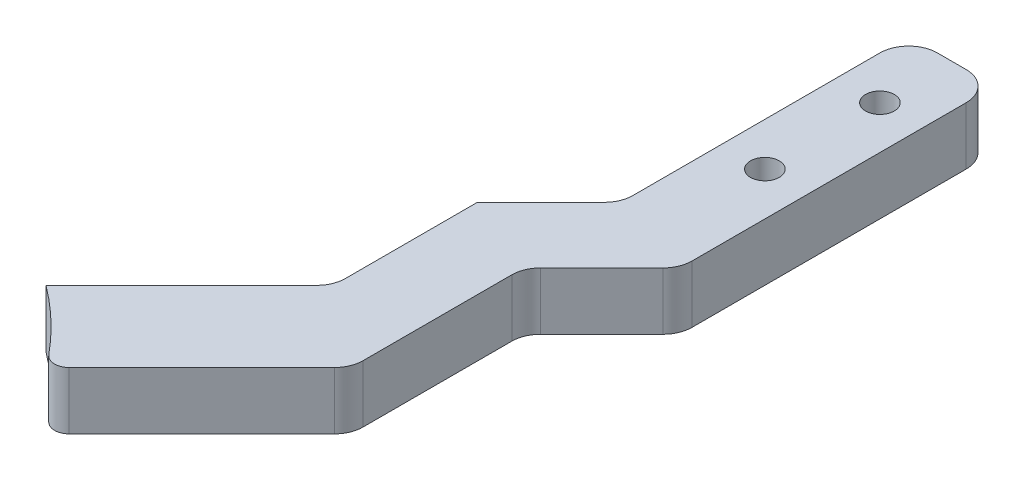
ISO-10303-21;
HEADER;
FILE_DESCRIPTION(('STEP AP214'),'2;1');
FILE_NAME('part.step','',(''),(''),'','','');
FILE_SCHEMA(('AUTOMOTIVE_DESIGN { 1 0 10303 214 1 1 1 1 }'));
ENDSEC;
DATA;
#1=APPLICATION_CONTEXT('core data for automotive mechanical design processes');
#2=APPLICATION_PROTOCOL_DEFINITION('international standard','automotive_design',2000,#1);
#3=PRODUCT_CONTEXT('',#1,'mechanical');
#4=PRODUCT('Part','Part','',(#3));
#5=PRODUCT_RELATED_PRODUCT_CATEGORY('part','',(#4));
#6=PRODUCT_DEFINITION_FORMATION('','',#4);
#7=PRODUCT_DEFINITION_CONTEXT('part definition',#1,'design');
#8=PRODUCT_DEFINITION('design','',#6,#7);
#9=PRODUCT_DEFINITION_SHAPE('','',#8);
#10=(LENGTH_UNIT() NAMED_UNIT(*) SI_UNIT(.MILLI.,.METRE.));
#11=(NAMED_UNIT(*) PLANE_ANGLE_UNIT() SI_UNIT($,.RADIAN.));
#12=(NAMED_UNIT(*) SI_UNIT($,.STERADIAN.) SOLID_ANGLE_UNIT());
#13=UNCERTAINTY_MEASURE_WITH_UNIT(LENGTH_MEASURE(1.E-05),#10,'distance_accuracy_value','');
#14=(GEOMETRIC_REPRESENTATION_CONTEXT(3) GLOBAL_UNCERTAINTY_ASSIGNED_CONTEXT((#13)) GLOBAL_UNIT_ASSIGNED_CONTEXT((#10,
#11,#12)) REPRESENTATION_CONTEXT('',''));
#15=CARTESIAN_POINT('',(0.,0.,0.));
#16=DIRECTION('',(0.,0.,1.));
#17=DIRECTION('',(1.,0.,0.));
#18=AXIS2_PLACEMENT_3D('',#15,#16,#17);
#19=CARTESIAN_POINT('',(0.,4.,0.));
#20=DIRECTION('',(0.,-1.,0.));
#21=DIRECTION('',(0.,0.,-1.));
#22=AXIS2_PLACEMENT_3D('',#19,#20,#21);
#23=PLANE('',#22);
#24=CARTESIAN_POINT('',(0.,4.,0.));
#25=DIRECTION('',(0.,-1.,0.));
#26=DIRECTION('',(0.,0.,-1.));
#27=AXIS2_PLACEMENT_3D('',#24,#25,#26);
#28=CIRCLE('',#27,25.);
#29=CARTESIAN_POINT('',(15.,4.,-20.));
#30=VERTEX_POINT('',#29);
#31=CARTESIAN_POINT('',(19.2736929535578,4.,-15.9224608629438));
#32=VERTEX_POINT('',#31);
#33=EDGE_CURVE('E170',#30,#32,#28,.T.);
#34=ORIENTED_EDGE('',*,*,#33,.T.);
#35=CARTESIAN_POINT('',(20.0446406717001,4.,-16.5593592974616));
#36=DIRECTION('',(0.,-1.,0.));
#37=DIRECTION('',(0.,0.,-1.));
#38=AXIS2_PLACEMENT_3D('',#35,#36,#37);
#39=CIRCLE('',#38,1.);
#40=CARTESIAN_POINT('',(20.7517474528866,4.,-15.852252516275));
#41=VERTEX_POINT('',#40);
#42=EDGE_CURVE('E11',#32,#41,#39,.F.);
#43=ORIENTED_EDGE('',*,*,#42,.T.);
#44=DIRECTION('',(0.707106781186551,0.,-0.707106781186544));
#45=VECTOR('',#44,1.);
#46=CARTESIAN_POINT('',(30.5634545248381,4.,-25.6639595882264));
#47=LINE('',#46,#45);
#48=CARTESIAN_POINT('',(29.9776680872112,4.,-25.0781731505995));
#49=VERTEX_POINT('',#48);
#50=EDGE_CURVE('E189',#41,#49,#47,.T.);
#51=ORIENTED_EDGE('',*,*,#50,.T.);
#52=CARTESIAN_POINT('',(28.5634545248381,4.,-26.4923867129726));
#53=DIRECTION('',(0.,-1.,0.));
#54=DIRECTION('',(0.,0.,-1.));
#55=AXIS2_PLACEMENT_3D('',#52,#53,#54);
#56=CIRCLE('',#55,2.);
#57=CARTESIAN_POINT('',(30.5634545248381,4.,-26.4923867129726));
#58=VERTEX_POINT('',#57);
#59=EDGE_CURVE('E265',#49,#58,#56,.F.);
#60=ORIENTED_EDGE('',*,*,#59,.T.);
#61=DIRECTION('',(0.,0.,-1.));
#62=VECTOR('',#61,1.);
#63=CARTESIAN_POINT('',(30.5634545248381,4.,-25.6639595882264));
#64=LINE('',#63,#62);
#65=CARTESIAN_POINT('',(30.5634545248381,4.,-36.8355324634802));
#66=VERTEX_POINT('',#65);
#67=EDGE_CURVE('E191',#58,#66,#64,.T.);
#68=ORIENTED_EDGE('',*,*,#67,.T.);
#69=CARTESIAN_POINT('',(32.5634545248381,4.,-36.8355324634802));
#70=DIRECTION('',(0.,-1.,0.));
#71=DIRECTION('',(0.,0.,-1.));
#72=AXIS2_PLACEMENT_3D('',#69,#70,#71);
#73=CIRCLE('',#72,2.);
#74=CARTESIAN_POINT('',(31.149240962465,4.,-38.2497460258533));
#75=VERTEX_POINT('',#74);
#76=EDGE_CURVE('E295',#66,#75,#73,.T.);
#77=ORIENTED_EDGE('',*,*,#76,.T.);
#78=DIRECTION('',(0.707106781186548,0.,-0.707106781186547));
#79=VECTOR('',#78,1.);
#80=CARTESIAN_POINT('',(30.5634545248381,4.,-37.6639595882264));
#81=LINE('',#80,#79);
#82=CARTESIAN_POINT('',(35.4142135623731,4.,-42.5147186257614));
#83=VERTEX_POINT('',#82);
#84=EDGE_CURVE('E197',#75,#83,#81,.T.);
#85=ORIENTED_EDGE('',*,*,#84,.T.);
#86=CARTESIAN_POINT('',(34.,4.,-43.9289321881345));
#87=DIRECTION('',(0.,-1.,0.));
#88=DIRECTION('',(0.,0.,-1.));
#89=AXIS2_PLACEMENT_3D('',#86,#87,#88);
#90=CIRCLE('',#89,2.);
#91=CARTESIAN_POINT('',(36.,4.,-43.9289321881345));
#92=VERTEX_POINT('',#91);
#93=EDGE_CURVE('E263',#83,#92,#90,.F.);
#94=ORIENTED_EDGE('',*,*,#93,.T.);
#95=DIRECTION('',(0.,0.,-1.));
#96=VECTOR('',#95,1.);
#97=CARTESIAN_POINT('',(36.0000000000001,4.,-64.9999999999999));
#98=LINE('',#97,#96);
#99=CARTESIAN_POINT('',(36.0000000000001,4.,-62.9999999999999));
#100=VERTEX_POINT('',#99);
#101=EDGE_CURVE('E200',#92,#100,#98,.T.);
#102=ORIENTED_EDGE('',*,*,#101,.T.);
#103=CARTESIAN_POINT('',(34.0000000000001,4.,-63.));
#104=DIRECTION('',(0.,-1.,0.));
#105=DIRECTION('',(0.,0.,-1.));
#106=AXIS2_PLACEMENT_3D('',#103,#104,#105);
#107=CIRCLE('',#106,2.);
#108=CARTESIAN_POINT('',(34.0000000000002,4.,-65.));
#109=VERTEX_POINT('',#108);
#110=EDGE_CURVE('E261',#100,#109,#107,.F.);
#111=ORIENTED_EDGE('',*,*,#110,.T.);
#112=DIRECTION('',(-1.,0.,0.));
#113=VECTOR('',#112,1.);
#114=CARTESIAN_POINT('',(30.0000000000001,4.,-65.));
#115=LINE('',#114,#113);
#116=CARTESIAN_POINT('',(32.0000000000002,4.,-65.));
#117=VERTEX_POINT('',#116);
#118=EDGE_CURVE('E203',#109,#117,#115,.T.);
#119=ORIENTED_EDGE('',*,*,#118,.T.);
#120=CARTESIAN_POINT('',(32.0000000000001,4.,-63.));
#121=DIRECTION('',(0.,-1.,0.));
#122=DIRECTION('',(0.,0.,-1.));
#123=AXIS2_PLACEMENT_3D('',#120,#121,#122);
#124=CIRCLE('',#123,2.);
#125=CARTESIAN_POINT('',(30.0000000000001,4.,-63.));
#126=VERTEX_POINT('',#125);
#127=EDGE_CURVE('E259',#117,#126,#124,.F.);
#128=ORIENTED_EDGE('',*,*,#127,.T.);
#129=DIRECTION('',(0.,0.,1.));
#130=VECTOR('',#129,1.);
#131=CARTESIAN_POINT('',(30.,4.,-45.));
#132=LINE('',#131,#130);
#133=CARTESIAN_POINT('',(30.,4.,-45.8284271247462));
#134=VERTEX_POINT('',#133);
#135=EDGE_CURVE('E206',#126,#134,#132,.T.);
#136=ORIENTED_EDGE('',*,*,#135,.T.);
#137=CARTESIAN_POINT('',(28.,4.,-45.8284271247462));
#138=DIRECTION('',(0.,-1.,0.));
#139=DIRECTION('',(0.,0.,-1.));
#140=AXIS2_PLACEMENT_3D('',#137,#138,#139);
#141=CIRCLE('',#140,2.);
#142=CARTESIAN_POINT('',(29.4142135623731,4.,-44.4142135623731));
#143=VERTEX_POINT('',#142);
#144=EDGE_CURVE('E299',#134,#143,#141,.T.);
#145=ORIENTED_EDGE('',*,*,#144,.T.);
#146=DIRECTION('',(-0.707106781186549,0.,0.707106781186546));
#147=VECTOR('',#146,1.);
#148=CARTESIAN_POINT('',(25.,4.,-40.));
#149=LINE('',#148,#147);
#150=CARTESIAN_POINT('',(25.,4.,-40.));
#151=VERTEX_POINT('',#150);
#152=EDGE_CURVE('E209',#143,#151,#149,.T.);
#153=ORIENTED_EDGE('',*,*,#152,.T.);
#154=DIRECTION('',(0.,0.,1.));
#155=VECTOR('',#154,1.);
#156=CARTESIAN_POINT('',(25.,4.,-30.));
#157=LINE('',#156,#155);
#158=CARTESIAN_POINT('',(25.,4.,-30.8284271247462));
#159=VERTEX_POINT('',#158);
#160=EDGE_CURVE('E178',#151,#159,#157,.T.);
#161=ORIENTED_EDGE('',*,*,#160,.T.);
#162=CARTESIAN_POINT('',(23.,4.,-30.8284271247462));
#163=DIRECTION('',(0.,-1.,0.));
#164=DIRECTION('',(0.,0.,-1.));
#165=AXIS2_PLACEMENT_3D('',#162,#163,#164);
#166=CIRCLE('',#165,2.);
#167=CARTESIAN_POINT('',(24.4142135623731,4.,-29.4142135623731));
#168=VERTEX_POINT('',#167);
#169=EDGE_CURVE('E174',#159,#168,#166,.T.);
#170=ORIENTED_EDGE('',*,*,#169,.T.);
#171=DIRECTION('',(-0.707106781186546,0.,0.707106781186549));
#172=VECTOR('',#171,1.);
#173=CARTESIAN_POINT('',(15.,4.,-20.));
#174=LINE('',#173,#172);
#175=EDGE_CURVE('E167',#168,#30,#174,.T.);
#176=ORIENTED_EDGE('',*,*,#175,.T.);
#177=EDGE_LOOP('',(#34,#43,#51,#60,#68,#77,#85,#94,#102,#111,#119,#128,#136,#145,#153,#161,#170,#176));
#178=FACE_BOUND('',#177,.T.);
#179=CARTESIAN_POINT('',(33.0000000000001,4.,-60.));
#180=DIRECTION('',(0.,1.,0.));
#181=DIRECTION('',(0.,0.,1.));
#182=AXIS2_PLACEMENT_3D('',#179,#180,#181);
#183=CIRCLE('',#182,0.999999999999996);
#184=CARTESIAN_POINT('',(33.0000000000001,4.,-59.));
#185=VERTEX_POINT('',#184);
#186=EDGE_CURVE('E214',#185,#185,#183,.T.);
#187=ORIENTED_EDGE('',*,*,#186,.F.);
#188=EDGE_LOOP('',(#187));
#189=FACE_BOUND('',#188,.T.);
#190=CARTESIAN_POINT('',(33.0000000000001,4.,-52.));
#191=DIRECTION('',(0.,1.,0.));
#192=DIRECTION('',(0.,0.,1.));
#193=AXIS2_PLACEMENT_3D('',#190,#191,#192);
#194=CIRCLE('',#193,1.00000000000001);
#195=CARTESIAN_POINT('',(33.0000000000001,4.,-51.));
#196=VERTEX_POINT('',#195);
#197=EDGE_CURVE('E375',#196,#196,#194,.T.);
#198=ORIENTED_EDGE('',*,*,#197,.F.);
#199=EDGE_LOOP('',(#198));
#200=FACE_BOUND('',#199,.T.);
#201=ADVANCED_FACE('F43',(#178,#189,#200),#23,.F.);
#202=CARTESIAN_POINT('',(0.,0.,0.));
#203=DIRECTION('',(0.,-1.,0.));
#204=DIRECTION('',(0.,0.,-1.));
#205=AXIS2_PLACEMENT_3D('',#202,#203,#204);
#206=PLANE('',#205);
#207=CARTESIAN_POINT('',(33.0000000000001,0.,-60.));
#208=DIRECTION('',(0.,1.,0.));
#209=DIRECTION('',(0.,0.,1.));
#210=AXIS2_PLACEMENT_3D('',#207,#208,#209);
#211=CIRCLE('',#210,0.999999999999996);
#212=CARTESIAN_POINT('',(33.0000000000001,0.,-59.));
#213=VERTEX_POINT('',#212);
#214=EDGE_CURVE('E372',#213,#213,#211,.T.);
#215=ORIENTED_EDGE('',*,*,#214,.T.);
#216=EDGE_LOOP('',(#215));
#217=FACE_BOUND('',#216,.T.);
#218=DIRECTION('',(0.707106781186551,0.,-0.707106781186544));
#219=VECTOR('',#218,1.);
#220=CARTESIAN_POINT('',(30.5634545248381,0.,-25.6639595882264));
#221=LINE('',#220,#219);
#222=CARTESIAN_POINT('',(20.7517474528866,0.,-15.852252516275));
#223=VERTEX_POINT('',#222);
#224=CARTESIAN_POINT('',(29.9776680872112,0.,-25.0781731505995));
#225=VERTEX_POINT('',#224);
#226=EDGE_CURVE('E218',#223,#225,#221,.T.);
#227=ORIENTED_EDGE('',*,*,#226,.F.);
#228=CARTESIAN_POINT('',(20.0446406717001,0.,-16.5593592974616));
#229=DIRECTION('',(0.,-1.,0.));
#230=DIRECTION('',(0.,0.,-1.));
#231=AXIS2_PLACEMENT_3D('',#228,#229,#230);
#232=CIRCLE('',#231,1.);
#233=CARTESIAN_POINT('',(19.2736929535578,0.,-15.9224608629438));
#234=VERTEX_POINT('',#233);
#235=EDGE_CURVE('E65',#223,#234,#232,.T.);
#236=ORIENTED_EDGE('',*,*,#235,.T.);
#237=CARTESIAN_POINT('',(0.,0.,0.));
#238=DIRECTION('',(0.,-1.,0.));
#239=DIRECTION('',(0.,0.,-1.));
#240=AXIS2_PLACEMENT_3D('',#237,#238,#239);
#241=CIRCLE('',#240,25.);
#242=CARTESIAN_POINT('',(15.,0.,-20.));
#243=VERTEX_POINT('',#242);
#244=EDGE_CURVE('E216',#243,#234,#241,.T.);
#245=ORIENTED_EDGE('',*,*,#244,.F.);
#246=DIRECTION('',(-0.707106781186546,0.,0.707106781186549));
#247=VECTOR('',#246,1.);
#248=CARTESIAN_POINT('',(15.,0.,-20.));
#249=LINE('',#248,#247);
#250=CARTESIAN_POINT('',(24.4142135623731,0.,-29.4142135623731));
#251=VERTEX_POINT('',#250);
#252=EDGE_CURVE('E184',#251,#243,#249,.T.);
#253=ORIENTED_EDGE('',*,*,#252,.F.);
#254=CARTESIAN_POINT('',(23.,0.,-30.8284271247462));
#255=DIRECTION('',(0.,-1.,0.));
#256=DIRECTION('',(0.,0.,-1.));
#257=AXIS2_PLACEMENT_3D('',#254,#255,#256);
#258=CIRCLE('',#257,2.);
#259=CARTESIAN_POINT('',(25.,0.,-30.8284271247462));
#260=VERTEX_POINT('',#259);
#261=EDGE_CURVE('E290',#251,#260,#258,.F.);
#262=ORIENTED_EDGE('',*,*,#261,.T.);
#263=DIRECTION('',(0.,0.,1.));
#264=VECTOR('',#263,1.);
#265=CARTESIAN_POINT('',(25.,0.,-30.));
#266=LINE('',#265,#264);
#267=CARTESIAN_POINT('',(25.,0.,-40.));
#268=VERTEX_POINT('',#267);
#269=EDGE_CURVE('E211',#268,#260,#266,.T.);
#270=ORIENTED_EDGE('',*,*,#269,.F.);
#271=DIRECTION('',(-0.707106781186549,0.,0.707106781186546));
#272=VECTOR('',#271,1.);
#273=CARTESIAN_POINT('',(25.,0.,-40.));
#274=LINE('',#273,#272);
#275=CARTESIAN_POINT('',(29.4142135623731,0.,-44.4142135623731));
#276=VERTEX_POINT('',#275);
#277=EDGE_CURVE('E235',#276,#268,#274,.T.);
#278=ORIENTED_EDGE('',*,*,#277,.F.);
#279=CARTESIAN_POINT('',(28.,0.,-45.8284271247462));
#280=DIRECTION('',(0.,-1.,0.));
#281=DIRECTION('',(0.,0.,-1.));
#282=AXIS2_PLACEMENT_3D('',#279,#280,#281);
#283=CIRCLE('',#282,2.);
#284=CARTESIAN_POINT('',(30.,0.,-45.8284271247462));
#285=VERTEX_POINT('',#284);
#286=EDGE_CURVE('E297',#276,#285,#283,.F.);
#287=ORIENTED_EDGE('',*,*,#286,.T.);
#288=DIRECTION('',(0.,0.,1.));
#289=VECTOR('',#288,1.);
#290=CARTESIAN_POINT('',(30.,0.,-45.));
#291=LINE('',#290,#289);
#292=CARTESIAN_POINT('',(30.0000000000001,0.,-63.));
#293=VERTEX_POINT('',#292);
#294=EDGE_CURVE('E232',#293,#285,#291,.T.);
#295=ORIENTED_EDGE('',*,*,#294,.F.);
#296=CARTESIAN_POINT('',(32.0000000000001,0.,-63.));
#297=DIRECTION('',(0.,-1.,0.));
#298=DIRECTION('',(0.,0.,-1.));
#299=AXIS2_PLACEMENT_3D('',#296,#297,#298);
#300=CIRCLE('',#299,2.);
#301=CARTESIAN_POINT('',(32.0000000000002,0.,-65.));
#302=VERTEX_POINT('',#301);
#303=EDGE_CURVE('E247',#293,#302,#300,.T.);
#304=ORIENTED_EDGE('',*,*,#303,.T.);
#305=DIRECTION('',(-1.,0.,0.));
#306=VECTOR('',#305,1.);
#307=CARTESIAN_POINT('',(30.0000000000001,0.,-65.));
#308=LINE('',#307,#306);
#309=CARTESIAN_POINT('',(34.0000000000002,0.,-65.));
#310=VERTEX_POINT('',#309);
#311=EDGE_CURVE('E229',#310,#302,#308,.T.);
#312=ORIENTED_EDGE('',*,*,#311,.F.);
#313=CARTESIAN_POINT('',(34.0000000000001,0.,-63.));
#314=DIRECTION('',(0.,-1.,0.));
#315=DIRECTION('',(0.,0.,-1.));
#316=AXIS2_PLACEMENT_3D('',#313,#314,#315);
#317=CIRCLE('',#316,2.);
#318=CARTESIAN_POINT('',(36.0000000000001,0.,-62.9999999999999));
#319=VERTEX_POINT('',#318);
#320=EDGE_CURVE('E249',#310,#319,#317,.T.);
#321=ORIENTED_EDGE('',*,*,#320,.T.);
#322=DIRECTION('',(0.,0.,-1.));
#323=VECTOR('',#322,1.);
#324=CARTESIAN_POINT('',(36.0000000000001,0.,-64.9999999999999));
#325=LINE('',#324,#323);
#326=CARTESIAN_POINT('',(36.,0.,-43.9289321881345));
#327=VERTEX_POINT('',#326);
#328=EDGE_CURVE('E226',#327,#319,#325,.T.);
#329=ORIENTED_EDGE('',*,*,#328,.F.);
#330=CARTESIAN_POINT('',(34.,0.,-43.9289321881345));
#331=DIRECTION('',(0.,-1.,0.));
#332=DIRECTION('',(0.,0.,-1.));
#333=AXIS2_PLACEMENT_3D('',#330,#331,#332);
#334=CIRCLE('',#333,2.);
#335=CARTESIAN_POINT('',(35.4142135623731,0.,-42.5147186257614));
#336=VERTEX_POINT('',#335);
#337=EDGE_CURVE('E251',#327,#336,#334,.T.);
#338=ORIENTED_EDGE('',*,*,#337,.T.);
#339=DIRECTION('',(0.707106781186548,0.,-0.707106781186547));
#340=VECTOR('',#339,1.);
#341=CARTESIAN_POINT('',(30.5634545248381,0.,-37.6639595882264));
#342=LINE('',#341,#340);
#343=CARTESIAN_POINT('',(31.149240962465,0.,-38.2497460258533));
#344=VERTEX_POINT('',#343);
#345=EDGE_CURVE('E223',#344,#336,#342,.T.);
#346=ORIENTED_EDGE('',*,*,#345,.F.);
#347=CARTESIAN_POINT('',(32.5634545248381,0.,-36.8355324634802));
#348=DIRECTION('',(0.,-1.,0.));
#349=DIRECTION('',(0.,0.,-1.));
#350=AXIS2_PLACEMENT_3D('',#347,#348,#349);
#351=CIRCLE('',#350,2.);
#352=CARTESIAN_POINT('',(30.5634545248381,0.,-36.8355324634802));
#353=VERTEX_POINT('',#352);
#354=EDGE_CURVE('E293',#344,#353,#351,.F.);
#355=ORIENTED_EDGE('',*,*,#354,.T.);
#356=DIRECTION('',(0.,0.,-1.));
#357=VECTOR('',#356,1.);
#358=CARTESIAN_POINT('',(30.5634545248381,0.,-25.6639595882264));
#359=LINE('',#358,#357);
#360=CARTESIAN_POINT('',(30.5634545248381,0.,-26.4923867129726));
#361=VERTEX_POINT('',#360);
#362=EDGE_CURVE('E220',#361,#353,#359,.T.);
#363=ORIENTED_EDGE('',*,*,#362,.F.);
#364=CARTESIAN_POINT('',(28.5634545248381,0.,-26.4923867129726));
#365=DIRECTION('',(0.,-1.,0.));
#366=DIRECTION('',(0.,0.,-1.));
#367=AXIS2_PLACEMENT_3D('',#364,#365,#366);
#368=CIRCLE('',#367,2.);
#369=EDGE_CURVE('E253',#361,#225,#368,.T.);
#370=ORIENTED_EDGE('',*,*,#369,.T.);
#371=EDGE_LOOP('',(#227,#236,#245,#253,#262,#270,#278,#287,#295,#304,#312,#321,#329,#338,#346,
#355,#363,#370));
#372=FACE_BOUND('',#371,.T.);
#373=CARTESIAN_POINT('',(33.0000000000001,0.,-52.));
#374=DIRECTION('',(0.,1.,0.));
#375=DIRECTION('',(0.,0.,1.));
#376=AXIS2_PLACEMENT_3D('',#373,#374,#375);
#377=CIRCLE('',#376,1.00000000000001);
#378=CARTESIAN_POINT('',(33.0000000000001,0.,-51.));
#379=VERTEX_POINT('',#378);
#380=EDGE_CURVE('E378',#379,#379,#377,.T.);
#381=ORIENTED_EDGE('',*,*,#380,.T.);
#382=EDGE_LOOP('',(#381));
#383=FACE_BOUND('',#382,.T.);
#384=ADVANCED_FACE('F309',(#217,#372,#383),#206,.T.);
#385=CARTESIAN_POINT('',(25.,4.,-30.));
#386=DIRECTION('',(1.,0.,0.));
#387=DIRECTION('',(0.,0.,-1.));
#388=AXIS2_PLACEMENT_3D('',#385,#386,#387);
#389=PLANE('',#388);
#390=ORIENTED_EDGE('',*,*,#269,.T.);
#391=DIRECTION('',(0.,-1.,0.));
#392=VECTOR('',#391,1.);
#393=CARTESIAN_POINT('',(25.,4.,-30.8284271247462));
#394=LINE('',#393,#392);
#395=EDGE_CURVE('E240',#260,#159,#394,.F.);
#396=ORIENTED_EDGE('',*,*,#395,.T.);
#397=ORIENTED_EDGE('',*,*,#160,.F.);
#398=DIRECTION('',(0.,-1.,0.));
#399=VECTOR('',#398,1.);
#400=CARTESIAN_POINT('',(25.,4.,-40.));
#401=LINE('',#400,#399);
#402=EDGE_CURVE('E186',#151,#268,#401,.T.);
#403=ORIENTED_EDGE('',*,*,#402,.T.);
#404=EDGE_LOOP('',(#390,#396,#397,#403));
#405=FACE_BOUND('',#404,.T.);
#406=ADVANCED_FACE('F369',(#405),#389,.F.);
#407=CARTESIAN_POINT('',(15.,4.,-20.));
#408=DIRECTION('',(0.707106781186549,0.,0.707106781186546));
#409=DIRECTION('',(0.707106781186546,0.,-0.707106781186549));
#410=AXIS2_PLACEMENT_3D('',#407,#408,#409);
#411=PLANE('',#410);
#412=ORIENTED_EDGE('',*,*,#175,.F.);
#413=DIRECTION('',(0.,-1.,0.));
#414=VECTOR('',#413,1.);
#415=CARTESIAN_POINT('',(24.4142135623731,0.,-29.4142135623731));
#416=LINE('',#415,#414);
#417=EDGE_CURVE('E185',#168,#251,#416,.T.);
#418=ORIENTED_EDGE('',*,*,#417,.T.);
#419=ORIENTED_EDGE('',*,*,#252,.T.);
#420=DIRECTION('',(0.,-1.,0.));
#421=VECTOR('',#420,1.);
#422=CARTESIAN_POINT('',(15.,4.,-20.));
#423=LINE('',#422,#421);
#424=EDGE_CURVE('E181',#30,#243,#423,.T.);
#425=ORIENTED_EDGE('',*,*,#424,.F.);
#426=EDGE_LOOP('',(#412,#418,#419,#425));
#427=FACE_BOUND('',#426,.T.);
#428=ADVANCED_FACE('F182',(#427),#411,.F.);
#429=CARTESIAN_POINT('',(0.,4.,0.));
#430=DIRECTION('',(0.,-1.,0.));
#431=DIRECTION('',(0.,0.,-1.));
#432=AXIS2_PLACEMENT_3D('',#429,#430,#431);
#433=CYLINDRICAL_SURFACE('',#432,25.);
#434=ORIENTED_EDGE('',*,*,#244,.T.);
#435=DIRECTION('',(0.,-1.,0.));
#436=VECTOR('',#435,1.);
#437=CARTESIAN_POINT('',(19.2736929535578,4.,-15.9224608629438));
#438=LINE('',#437,#436);
#439=EDGE_CURVE('E51',#234,#32,#438,.F.);
#440=ORIENTED_EDGE('',*,*,#439,.T.);
#441=ORIENTED_EDGE('',*,*,#33,.F.);
#442=ORIENTED_EDGE('',*,*,#424,.T.);
#443=EDGE_LOOP('',(#434,#440,#441,#442));
#444=FACE_BOUND('',#443,.T.);
#445=ADVANCED_FACE('F188',(#444),#433,.F.);
#446=CARTESIAN_POINT('',(30.5634545248381,4.,-25.6639595882264));
#447=DIRECTION('',(-0.707106781186544,0.,-0.707106781186551));
#448=DIRECTION('',(-0.707106781186551,0.,0.707106781186544));
#449=AXIS2_PLACEMENT_3D('',#446,#447,#448);
#450=PLANE('',#449);
#451=ORIENTED_EDGE('',*,*,#50,.F.);
#452=DIRECTION('',(0.,-1.,0.));
#453=VECTOR('',#452,1.);
#454=CARTESIAN_POINT('',(20.7517474528866,4.,-15.852252516275));
#455=LINE('',#454,#453);
#456=EDGE_CURVE('E301',#41,#223,#455,.T.);
#457=ORIENTED_EDGE('',*,*,#456,.T.);
#458=ORIENTED_EDGE('',*,*,#226,.T.);
#459=DIRECTION('',(0.,-1.,0.));
#460=VECTOR('',#459,1.);
#461=CARTESIAN_POINT('',(29.9776680872112,4.,-25.0781731505995));
#462=LINE('',#461,#460);
#463=EDGE_CURVE('E256',#225,#49,#462,.F.);
#464=ORIENTED_EDGE('',*,*,#463,.T.);
#465=EDGE_LOOP('',(#451,#457,#458,#464));
#466=FACE_BOUND('',#465,.T.);
#467=ADVANCED_FACE('F307',(#466),#450,.F.);
#468=CARTESIAN_POINT('',(30.5634545248381,4.,-25.6639595882264));
#469=DIRECTION('',(-1.,0.,0.));
#470=DIRECTION('',(0.,0.,1.));
#471=AXIS2_PLACEMENT_3D('',#468,#469,#470);
#472=PLANE('',#471);
#473=ORIENTED_EDGE('',*,*,#67,.F.);
#474=DIRECTION('',(0.,-1.,0.));
#475=VECTOR('',#474,1.);
#476=CARTESIAN_POINT('',(30.5634545248381,4.,-26.4923867129726));
#477=LINE('',#476,#475);
#478=EDGE_CURVE('E244',#58,#361,#477,.T.);
#479=ORIENTED_EDGE('',*,*,#478,.T.);
#480=ORIENTED_EDGE('',*,*,#362,.T.);
#481=DIRECTION('',(0.,-1.,0.));
#482=VECTOR('',#481,1.);
#483=CARTESIAN_POINT('',(30.5634545248381,4.,-36.8355324634802));
#484=LINE('',#483,#482);
#485=EDGE_CURVE('E242',#353,#66,#484,.F.);
#486=ORIENTED_EDGE('',*,*,#485,.T.);
#487=EDGE_LOOP('',(#473,#479,#480,#486));
#488=FACE_BOUND('',#487,.T.);
#489=ADVANCED_FACE('F320',(#488),#472,.F.);
#490=CARTESIAN_POINT('',(30.5634545248381,4.,-37.6639595882264));
#491=DIRECTION('',(-0.707106781186547,0.,-0.707106781186549));
#492=DIRECTION('',(-0.707106781186549,0.,0.707106781186547));
#493=AXIS2_PLACEMENT_3D('',#490,#491,#492);
#494=PLANE('',#493);
#495=ORIENTED_EDGE('',*,*,#84,.F.);
#496=DIRECTION('',(0.,-1.,0.));
#497=VECTOR('',#496,1.);
#498=CARTESIAN_POINT('',(31.149240962465,0.,-38.2497460258533));
#499=LINE('',#498,#497);
#500=EDGE_CURVE('E269',#75,#344,#499,.T.);
#501=ORIENTED_EDGE('',*,*,#500,.T.);
#502=ORIENTED_EDGE('',*,*,#345,.T.);
#503=DIRECTION('',(0.,-1.,0.));
#504=VECTOR('',#503,1.);
#505=CARTESIAN_POINT('',(35.4142135623731,4.,-42.5147186257614));
#506=LINE('',#505,#504);
#507=EDGE_CURVE('E267',#336,#83,#506,.F.);
#508=ORIENTED_EDGE('',*,*,#507,.T.);
#509=EDGE_LOOP('',(#495,#501,#502,#508));
#510=FACE_BOUND('',#509,.T.);
#511=ADVANCED_FACE('F328',(#510),#494,.F.);
#512=CARTESIAN_POINT('',(36.0000000000001,4.,-64.9999999999999));
#513=DIRECTION('',(-1.,0.,0.));
#514=DIRECTION('',(0.,0.,1.));
#515=AXIS2_PLACEMENT_3D('',#512,#513,#514);
#516=PLANE('',#515);
#517=ORIENTED_EDGE('',*,*,#101,.F.);
#518=DIRECTION('',(0.,-1.,0.));
#519=VECTOR('',#518,1.);
#520=CARTESIAN_POINT('',(36.,4.,-43.9289321881345));
#521=LINE('',#520,#519);
#522=EDGE_CURVE('E282',#92,#327,#521,.T.);
#523=ORIENTED_EDGE('',*,*,#522,.T.);
#524=ORIENTED_EDGE('',*,*,#328,.T.);
#525=DIRECTION('',(0.,-1.,0.));
#526=VECTOR('',#525,1.);
#527=CARTESIAN_POINT('',(36.0000000000001,4.,-62.9999999999999));
#528=LINE('',#527,#526);
#529=EDGE_CURVE('E280',#319,#100,#528,.F.);
#530=ORIENTED_EDGE('',*,*,#529,.T.);
#531=EDGE_LOOP('',(#517,#523,#524,#530));
#532=FACE_BOUND('',#531,.T.);
#533=ADVANCED_FACE('F337',(#532),#516,.F.);
#534=CARTESIAN_POINT('',(30.0000000000001,4.,-65.));
#535=DIRECTION('',(0.,0.,1.));
#536=DIRECTION('',(1.,0.,0.));
#537=AXIS2_PLACEMENT_3D('',#534,#535,#536);
#538=PLANE('',#537);
#539=ORIENTED_EDGE('',*,*,#118,.F.);
#540=DIRECTION('',(0.,-1.,0.));
#541=VECTOR('',#540,1.);
#542=CARTESIAN_POINT('',(34.0000000000002,4.,-65.));
#543=LINE('',#542,#541);
#544=EDGE_CURVE('E287',#109,#310,#543,.T.);
#545=ORIENTED_EDGE('',*,*,#544,.T.);
#546=ORIENTED_EDGE('',*,*,#311,.T.);
#547=DIRECTION('',(0.,-1.,0.));
#548=VECTOR('',#547,1.);
#549=CARTESIAN_POINT('',(32.0000000000002,4.,-65.));
#550=LINE('',#549,#548);
#551=EDGE_CURVE('E285',#302,#117,#550,.F.);
#552=ORIENTED_EDGE('',*,*,#551,.T.);
#553=EDGE_LOOP('',(#539,#545,#546,#552));
#554=FACE_BOUND('',#553,.T.);
#555=ADVANCED_FACE('F346',(#554),#538,.F.);
#556=CARTESIAN_POINT('',(30.,4.,-45.));
#557=DIRECTION('',(1.,0.,0.));
#558=DIRECTION('',(0.,0.,-1.));
#559=AXIS2_PLACEMENT_3D('',#556,#557,#558);
#560=PLANE('',#559);
#561=ORIENTED_EDGE('',*,*,#294,.T.);
#562=DIRECTION('',(0.,-1.,0.));
#563=VECTOR('',#562,1.);
#564=CARTESIAN_POINT('',(30.,4.,-45.8284271247462));
#565=LINE('',#564,#563);
#566=EDGE_CURVE('E278',#285,#134,#565,.F.);
#567=ORIENTED_EDGE('',*,*,#566,.T.);
#568=ORIENTED_EDGE('',*,*,#135,.F.);
#569=DIRECTION('',(0.,-1.,0.));
#570=VECTOR('',#569,1.);
#571=CARTESIAN_POINT('',(30.0000000000001,4.,-63.));
#572=LINE('',#571,#570);
#573=EDGE_CURVE('E275',#126,#293,#572,.T.);
#574=ORIENTED_EDGE('',*,*,#573,.T.);
#575=EDGE_LOOP('',(#561,#567,#568,#574));
#576=FACE_BOUND('',#575,.T.);
#577=ADVANCED_FACE('F355',(#576),#560,.F.);
#578=CARTESIAN_POINT('',(25.,4.,-40.));
#579=DIRECTION('',(0.707106781186546,0.,0.707106781186549));
#580=DIRECTION('',(0.707106781186549,0.,-0.707106781186546));
#581=AXIS2_PLACEMENT_3D('',#578,#579,#580);
#582=PLANE('',#581);
#583=ORIENTED_EDGE('',*,*,#152,.F.);
#584=DIRECTION('',(0.,-1.,0.));
#585=VECTOR('',#584,1.);
#586=CARTESIAN_POINT('',(29.4142135623731,0.,-44.4142135623731));
#587=LINE('',#586,#585);
#588=EDGE_CURVE('E272',#143,#276,#587,.T.);
#589=ORIENTED_EDGE('',*,*,#588,.T.);
#590=ORIENTED_EDGE('',*,*,#277,.T.);
#591=ORIENTED_EDGE('',*,*,#402,.F.);
#592=EDGE_LOOP('',(#583,#589,#590,#591));
#593=FACE_BOUND('',#592,.T.);
#594=ADVANCED_FACE('F364',(#593),#582,.F.);
#595=CARTESIAN_POINT('',(33.0000000000001,4.,-60.));
#596=DIRECTION('',(0.,-1.,0.));
#597=DIRECTION('',(0.,0.,-1.));
#598=AXIS2_PLACEMENT_3D('',#595,#596,#597);
#599=CYLINDRICAL_SURFACE('',#598,0.999999999999996);
#600=ORIENTED_EDGE('',*,*,#186,.T.);
#601=EDGE_LOOP('',(#600));
#602=FACE_BOUND('',#601,.T.);
#603=ORIENTED_EDGE('',*,*,#214,.F.);
#604=EDGE_LOOP('',(#603));
#605=FACE_BOUND('',#604,.T.);
#606=ADVANCED_FACE('F396',(#602,#605),#599,.F.);
#607=CARTESIAN_POINT('',(33.0000000000001,4.,-52.));
#608=DIRECTION('',(0.,-1.,0.));
#609=DIRECTION('',(0.,0.,-1.));
#610=AXIS2_PLACEMENT_3D('',#607,#608,#609);
#611=CYLINDRICAL_SURFACE('',#610,1.00000000000001);
#612=ORIENTED_EDGE('',*,*,#197,.T.);
#613=EDGE_LOOP('',(#612));
#614=FACE_BOUND('',#613,.T.);
#615=ORIENTED_EDGE('',*,*,#380,.F.);
#616=EDGE_LOOP('',(#615));
#617=FACE_BOUND('',#616,.T.);
#618=ADVANCED_FACE('F384',(#614,#617),#611,.F.);
#619=CARTESIAN_POINT('',(23.,4.,-30.8284271247462));
#620=DIRECTION('',(0.,1.,0.));
#621=DIRECTION('',(0.,0.,1.));
#622=AXIS2_PLACEMENT_3D('',#619,#620,#621);
#623=CYLINDRICAL_SURFACE('',#622,2.);
#624=ORIENTED_EDGE('',*,*,#169,.F.);
#625=ORIENTED_EDGE('',*,*,#395,.F.);
#626=ORIENTED_EDGE('',*,*,#261,.F.);
#627=ORIENTED_EDGE('',*,*,#417,.F.);
#628=EDGE_LOOP('',(#624,#625,#626,#627));
#629=FACE_BOUND('',#628,.T.);
#630=ADVANCED_FACE('F419',(#629),#623,.F.);
#631=CARTESIAN_POINT('',(28.5634545248381,4.,-26.4923867129726));
#632=DIRECTION('',(0.,-1.,0.));
#633=DIRECTION('',(0.,0.,-1.));
#634=AXIS2_PLACEMENT_3D('',#631,#632,#633);
#635=CYLINDRICAL_SURFACE('',#634,2.);
#636=ORIENTED_EDGE('',*,*,#59,.F.);
#637=ORIENTED_EDGE('',*,*,#463,.F.);
#638=ORIENTED_EDGE('',*,*,#369,.F.);
#639=ORIENTED_EDGE('',*,*,#478,.F.);
#640=EDGE_LOOP('',(#636,#637,#638,#639));
#641=FACE_BOUND('',#640,.T.);
#642=ADVANCED_FACE('F316',(#641),#635,.T.);
#643=CARTESIAN_POINT('',(32.5634545248381,4.,-36.8355324634802));
#644=DIRECTION('',(0.,1.,0.));
#645=DIRECTION('',(0.,0.,1.));
#646=AXIS2_PLACEMENT_3D('',#643,#644,#645);
#647=CYLINDRICAL_SURFACE('',#646,2.);
#648=ORIENTED_EDGE('',*,*,#76,.F.);
#649=ORIENTED_EDGE('',*,*,#485,.F.);
#650=ORIENTED_EDGE('',*,*,#354,.F.);
#651=ORIENTED_EDGE('',*,*,#500,.F.);
#652=EDGE_LOOP('',(#648,#649,#650,#651));
#653=FACE_BOUND('',#652,.T.);
#654=ADVANCED_FACE('F323',(#653),#647,.F.);
#655=CARTESIAN_POINT('',(28.,4.,-45.8284271247462));
#656=DIRECTION('',(0.,1.,0.));
#657=DIRECTION('',(0.,0.,1.));
#658=AXIS2_PLACEMENT_3D('',#655,#656,#657);
#659=CYLINDRICAL_SURFACE('',#658,2.);
#660=ORIENTED_EDGE('',*,*,#144,.F.);
#661=ORIENTED_EDGE('',*,*,#566,.F.);
#662=ORIENTED_EDGE('',*,*,#286,.F.);
#663=ORIENTED_EDGE('',*,*,#588,.F.);
#664=EDGE_LOOP('',(#660,#661,#662,#663));
#665=FACE_BOUND('',#664,.T.);
#666=ADVANCED_FACE('F359',(#665),#659,.F.);
#667=CARTESIAN_POINT('',(34.,4.,-43.9289321881345));
#668=DIRECTION('',(0.,-1.,0.));
#669=DIRECTION('',(0.,0.,-1.));
#670=AXIS2_PLACEMENT_3D('',#667,#668,#669);
#671=CYLINDRICAL_SURFACE('',#670,2.);
#672=ORIENTED_EDGE('',*,*,#93,.F.);
#673=ORIENTED_EDGE('',*,*,#507,.F.);
#674=ORIENTED_EDGE('',*,*,#337,.F.);
#675=ORIENTED_EDGE('',*,*,#522,.F.);
#676=EDGE_LOOP('',(#672,#673,#674,#675));
#677=FACE_BOUND('',#676,.T.);
#678=ADVANCED_FACE('F332',(#677),#671,.T.);
#679=CARTESIAN_POINT('',(34.0000000000001,4.,-63.));
#680=DIRECTION('',(0.,-1.,0.));
#681=DIRECTION('',(0.,0.,-1.));
#682=AXIS2_PLACEMENT_3D('',#679,#680,#681);
#683=CYLINDRICAL_SURFACE('',#682,2.);
#684=ORIENTED_EDGE('',*,*,#110,.F.);
#685=ORIENTED_EDGE('',*,*,#529,.F.);
#686=ORIENTED_EDGE('',*,*,#320,.F.);
#687=ORIENTED_EDGE('',*,*,#544,.F.);
#688=EDGE_LOOP('',(#684,#685,#686,#687));
#689=FACE_BOUND('',#688,.T.);
#690=ADVANCED_FACE('F341',(#689),#683,.T.);
#691=CARTESIAN_POINT('',(32.0000000000001,4.,-63.));
#692=DIRECTION('',(0.,-1.,0.));
#693=DIRECTION('',(0.,0.,-1.));
#694=AXIS2_PLACEMENT_3D('',#691,#692,#693);
#695=CYLINDRICAL_SURFACE('',#694,2.);
#696=ORIENTED_EDGE('',*,*,#127,.F.);
#697=ORIENTED_EDGE('',*,*,#551,.F.);
#698=ORIENTED_EDGE('',*,*,#303,.F.);
#699=ORIENTED_EDGE('',*,*,#573,.F.);
#700=EDGE_LOOP('',(#696,#697,#698,#699));
#701=FACE_BOUND('',#700,.T.);
#702=ADVANCED_FACE('F350',(#701),#695,.T.);
#703=CARTESIAN_POINT('',(20.0446406717001,4.,-16.5593592974616));
#704=DIRECTION('',(0.,-1.,0.));
#705=DIRECTION('',(0.,0.,-1.));
#706=AXIS2_PLACEMENT_3D('',#703,#704,#705);
#707=CYLINDRICAL_SURFACE('',#706,1.);
#708=ORIENTED_EDGE('',*,*,#42,.F.);
#709=ORIENTED_EDGE('',*,*,#439,.F.);
#710=ORIENTED_EDGE('',*,*,#235,.F.);
#711=ORIENTED_EDGE('',*,*,#456,.F.);
#712=EDGE_LOOP('',(#708,#709,#710,#711));
#713=FACE_BOUND('',#712,.T.);
#714=ADVANCED_FACE('F45',(#713),#707,.T.);
#715=CLOSED_SHELL('',(#201,#384,#406,#428,#445,#467,#489,#511,#533,#555,#577,#594,#606,#618,
#630,#642,#654,#666,#678,#690,#702,#714));
#716=MANIFOLD_SOLID_BREP('B2',#715);
#717=ADVANCED_BREP_SHAPE_REPRESENTATION('',(#18,#716),#14);
#718=SHAPE_DEFINITION_REPRESENTATION(#9,#717);
ENDSEC;
END-ISO-10303-21;
